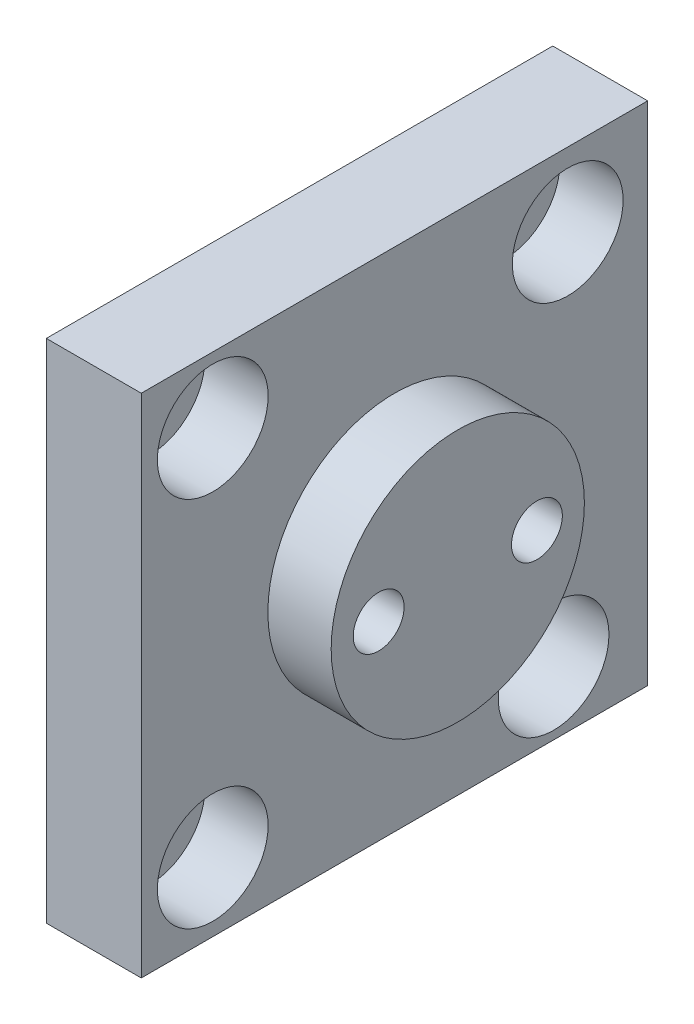
ISO-10303-21;
HEADER;
FILE_DESCRIPTION(('STEP AP214'),'2;1');
FILE_NAME('part.step','',(''),(''),'','','');
FILE_SCHEMA(('AUTOMOTIVE_DESIGN { 1 0 10303 214 1 1 1 1 }'));
ENDSEC;
DATA;
#1=APPLICATION_CONTEXT('core data for automotive mechanical design processes');
#2=APPLICATION_PROTOCOL_DEFINITION('international standard','automotive_design',2000,#1);
#3=PRODUCT_CONTEXT('',#1,'mechanical');
#4=PRODUCT('Part','Part','',(#3));
#5=PRODUCT_RELATED_PRODUCT_CATEGORY('part','',(#4));
#6=PRODUCT_DEFINITION_FORMATION('','',#4);
#7=PRODUCT_DEFINITION_CONTEXT('part definition',#1,'design');
#8=PRODUCT_DEFINITION('design','',#6,#7);
#9=PRODUCT_DEFINITION_SHAPE('','',#8);
#10=(LENGTH_UNIT() NAMED_UNIT(*) SI_UNIT(.MILLI.,.METRE.));
#11=(NAMED_UNIT(*) PLANE_ANGLE_UNIT() SI_UNIT($,.RADIAN.));
#12=(NAMED_UNIT(*) SI_UNIT($,.STERADIAN.) SOLID_ANGLE_UNIT());
#13=UNCERTAINTY_MEASURE_WITH_UNIT(LENGTH_MEASURE(1.E-05),#10,'distance_accuracy_value','');
#14=(GEOMETRIC_REPRESENTATION_CONTEXT(3) GLOBAL_UNCERTAINTY_ASSIGNED_CONTEXT((#13)) GLOBAL_UNIT_ASSIGNED_CONTEXT((#10,
#11,#12)) REPRESENTATION_CONTEXT('',''));
#15=CARTESIAN_POINT('',(0.,0.,0.));
#16=DIRECTION('',(0.,0.,1.));
#17=DIRECTION('',(1.,0.,0.));
#18=AXIS2_PLACEMENT_3D('',#15,#16,#17);
#19=CARTESIAN_POINT('',(9.525,25.4,-25.4));
#20=DIRECTION('',(0.,0.,1.));
#21=DIRECTION('',(0.,-1.,0.));
#22=AXIS2_PLACEMENT_3D('',#19,#20,#21);
#23=PLANE('',#22);
#24=DIRECTION('',(0.,1.,0.));
#25=VECTOR('',#24,1.);
#26=CARTESIAN_POINT('',(0.,25.4,-25.4));
#27=LINE('',#26,#25);
#28=CARTESIAN_POINT('',(0.,-25.4,-25.4));
#29=VERTEX_POINT('',#28);
#30=CARTESIAN_POINT('',(0.,25.4,-25.4));
#31=VERTEX_POINT('',#30);
#32=EDGE_CURVE('E108',#29,#31,#27,.T.);
#33=ORIENTED_EDGE('',*,*,#32,.T.);
#34=DIRECTION('',(-1.,0.,0.));
#35=VECTOR('',#34,1.);
#36=CARTESIAN_POINT('',(9.525,25.4,-25.4));
#37=LINE('',#36,#35);
#38=CARTESIAN_POINT('',(9.525,25.4,-25.4));
#39=VERTEX_POINT('',#38);
#40=EDGE_CURVE('E45',#39,#31,#37,.T.);
#41=ORIENTED_EDGE('',*,*,#40,.F.);
#42=DIRECTION('',(0.,1.,0.));
#43=VECTOR('',#42,1.);
#44=CARTESIAN_POINT('',(9.525,25.4,-25.4));
#45=LINE('',#44,#43);
#46=CARTESIAN_POINT('',(9.525,-25.4,-25.4));
#47=VERTEX_POINT('',#46);
#48=EDGE_CURVE('E95',#47,#39,#45,.T.);
#49=ORIENTED_EDGE('',*,*,#48,.F.);
#50=DIRECTION('',(-1.,0.,0.));
#51=VECTOR('',#50,1.);
#52=CARTESIAN_POINT('',(9.525,-25.4,-25.4));
#53=LINE('',#52,#51);
#54=EDGE_CURVE('E104',#47,#29,#53,.T.);
#55=ORIENTED_EDGE('',*,*,#54,.T.);
#56=EDGE_LOOP('',(#33,#41,#49,#55));
#57=FACE_BOUND('',#56,.T.);
#58=ADVANCED_FACE('F42',(#57),#23,.F.);
#59=CARTESIAN_POINT('',(9.525,25.4,25.4));
#60=DIRECTION('',(0.,-1.,0.));
#61=DIRECTION('',(0.,0.,-1.));
#62=AXIS2_PLACEMENT_3D('',#59,#60,#61);
#63=PLANE('',#62);
#64=DIRECTION('',(0.,0.,1.));
#65=VECTOR('',#64,1.);
#66=CARTESIAN_POINT('',(0.,25.4,25.4));
#67=LINE('',#66,#65);
#68=CARTESIAN_POINT('',(0.,25.4,25.4));
#69=VERTEX_POINT('',#68);
#70=EDGE_CURVE('E100',#31,#69,#67,.T.);
#71=ORIENTED_EDGE('',*,*,#70,.T.);
#72=DIRECTION('',(-1.,0.,0.));
#73=VECTOR('',#72,1.);
#74=CARTESIAN_POINT('',(9.525,25.4,25.4));
#75=LINE('',#74,#73);
#76=CARTESIAN_POINT('',(9.525,25.4,25.4));
#77=VERTEX_POINT('',#76);
#78=EDGE_CURVE('E98',#77,#69,#75,.T.);
#79=ORIENTED_EDGE('',*,*,#78,.F.);
#80=DIRECTION('',(0.,0.,1.));
#81=VECTOR('',#80,1.);
#82=CARTESIAN_POINT('',(9.525,25.4,25.4));
#83=LINE('',#82,#81);
#84=EDGE_CURVE('E90',#39,#77,#83,.T.);
#85=ORIENTED_EDGE('',*,*,#84,.F.);
#86=ORIENTED_EDGE('',*,*,#40,.T.);
#87=EDGE_LOOP('',(#71,#79,#85,#86));
#88=FACE_BOUND('',#87,.T.);
#89=ADVANCED_FACE('F99',(#88),#63,.F.);
#90=CARTESIAN_POINT('',(9.525,25.4,25.4));
#91=DIRECTION('',(0.,0.,-1.));
#92=DIRECTION('',(-1.,0.,0.));
#93=AXIS2_PLACEMENT_3D('',#90,#91,#92);
#94=PLANE('',#93);
#95=DIRECTION('',(0.,-1.,0.));
#96=VECTOR('',#95,1.);
#97=CARTESIAN_POINT('',(0.,25.4,25.4));
#98=LINE('',#97,#96);
#99=CARTESIAN_POINT('',(0.,-25.4,25.4));
#100=VERTEX_POINT('',#99);
#101=EDGE_CURVE('E76',#69,#100,#98,.T.);
#102=ORIENTED_EDGE('',*,*,#101,.T.);
#103=DIRECTION('',(-1.,0.,0.));
#104=VECTOR('',#103,1.);
#105=CARTESIAN_POINT('',(9.525,-25.4,25.4));
#106=LINE('',#105,#104);
#107=CARTESIAN_POINT('',(9.525,-25.4,25.4));
#108=VERTEX_POINT('',#107);
#109=EDGE_CURVE('E101',#108,#100,#106,.T.);
#110=ORIENTED_EDGE('',*,*,#109,.F.);
#111=DIRECTION('',(0.,-1.,0.));
#112=VECTOR('',#111,1.);
#113=CARTESIAN_POINT('',(9.525,25.4,25.4));
#114=LINE('',#113,#112);
#115=EDGE_CURVE('E93',#77,#108,#114,.T.);
#116=ORIENTED_EDGE('',*,*,#115,.F.);
#117=ORIENTED_EDGE('',*,*,#78,.T.);
#118=EDGE_LOOP('',(#102,#110,#116,#117));
#119=FACE_BOUND('',#118,.T.);
#120=ADVANCED_FACE('F102',(#119),#94,.F.);
#121=CARTESIAN_POINT('',(9.525,-25.4,25.4));
#122=DIRECTION('',(0.,1.,0.));
#123=DIRECTION('',(0.,0.,1.));
#124=AXIS2_PLACEMENT_3D('',#121,#122,#123);
#125=PLANE('',#124);
#126=DIRECTION('',(0.,0.,-1.));
#127=VECTOR('',#126,1.);
#128=CARTESIAN_POINT('',(0.,-25.4,25.4));
#129=LINE('',#128,#127);
#130=EDGE_CURVE('E82',#100,#29,#129,.T.);
#131=ORIENTED_EDGE('',*,*,#130,.T.);
#132=ORIENTED_EDGE('',*,*,#54,.F.);
#133=DIRECTION('',(0.,0.,-1.));
#134=VECTOR('',#133,1.);
#135=CARTESIAN_POINT('',(9.525,-25.4,25.4));
#136=LINE('',#135,#134);
#137=EDGE_CURVE('E59',#108,#47,#136,.T.);
#138=ORIENTED_EDGE('',*,*,#137,.F.);
#139=ORIENTED_EDGE('',*,*,#109,.T.);
#140=EDGE_LOOP('',(#131,#132,#138,#139));
#141=FACE_BOUND('',#140,.T.);
#142=ADVANCED_FACE('F116',(#141),#125,.F.);
#143=CARTESIAN_POINT('',(9.525,0.,0.));
#144=DIRECTION('',(1.,0.,0.));
#145=DIRECTION('',(0.,0.,-1.));
#146=AXIS2_PLACEMENT_3D('',#143,#144,#145);
#147=PLANE('',#146);
#148=CARTESIAN_POINT('',(9.525,18.7966388197296,18.2291931195114));
#149=DIRECTION('',(1.,0.,0.));
#150=DIRECTION('',(0.,0.,-1.));
#151=AXIS2_PLACEMENT_3D('',#148,#149,#150);
#152=CIRCLE('',#151,5.55625);
#153=CARTESIAN_POINT('',(9.525,18.7966388197296,12.6729431195114));
#154=VERTEX_POINT('',#153);
#155=EDGE_CURVE('E181',#154,#154,#152,.T.);
#156=ORIENTED_EDGE('',*,*,#155,.F.);
#157=EDGE_LOOP('',(#156));
#158=FACE_BOUND('',#157,.T.);
#159=CARTESIAN_POINT('',(9.525,18.0164009819295,-17.3780245691841));
#160=DIRECTION('',(1.,0.,0.));
#161=DIRECTION('',(0.,0.,-1.));
#162=AXIS2_PLACEMENT_3D('',#159,#160,#161);
#163=CIRCLE('',#162,5.55625);
#164=CARTESIAN_POINT('',(9.525,18.0164009819295,-22.9342745691841));
#165=VERTEX_POINT('',#164);
#166=EDGE_CURVE('E169',#165,#165,#163,.T.);
#167=ORIENTED_EDGE('',*,*,#166,.F.);
#168=EDGE_LOOP('',(#167));
#169=FACE_BOUND('',#168,.T.);
#170=CARTESIAN_POINT('',(9.525,-19.0094309573116,-15.9594103186384));
#171=DIRECTION('',(1.,0.,0.));
#172=DIRECTION('',(0.,0.,-1.));
#173=AXIS2_PLACEMENT_3D('',#170,#171,#172);
#174=CIRCLE('',#173,5.55625);
#175=CARTESIAN_POINT('',(9.525,-19.0094309573116,-21.5156603186384));
#176=VERTEX_POINT('',#175);
#177=EDGE_CURVE('E157',#176,#176,#174,.T.);
#178=ORIENTED_EDGE('',*,*,#177,.F.);
#179=EDGE_LOOP('',(#178));
#180=FACE_BOUND('',#179,.T.);
#181=CARTESIAN_POINT('',(9.525,-18.5129159696206,18.2291931195114));
#182=DIRECTION('',(1.,0.,0.));
#183=DIRECTION('',(0.,0.,-1.));
#184=AXIS2_PLACEMENT_3D('',#181,#182,#183);
#185=CIRCLE('',#184,5.55625);
#186=CARTESIAN_POINT('',(9.525,-18.5129159696206,12.6729431195114));
#187=VERTEX_POINT('',#186);
#188=EDGE_CURVE('E145',#187,#187,#185,.T.);
#189=ORIENTED_EDGE('',*,*,#188,.F.);
#190=EDGE_LOOP('',(#189));
#191=FACE_BOUND('',#190,.T.);
#192=CARTESIAN_POINT('',(9.525,0.,0.));
#193=DIRECTION('',(1.,0.,0.));
#194=DIRECTION('',(0.,0.,-1.));
#195=AXIS2_PLACEMENT_3D('',#192,#193,#194);
#196=CIRCLE('',#195,12.7);
#197=CARTESIAN_POINT('',(9.525,0.,-12.7));
#198=VERTEX_POINT('',#197);
#199=EDGE_CURVE('E11',#198,#198,#196,.T.);
#200=ORIENTED_EDGE('',*,*,#199,.F.);
#201=EDGE_LOOP('',(#200));
#202=FACE_BOUND('',#201,.T.);
#203=ORIENTED_EDGE('',*,*,#48,.T.);
#204=ORIENTED_EDGE('',*,*,#84,.T.);
#205=ORIENTED_EDGE('',*,*,#115,.T.);
#206=ORIENTED_EDGE('',*,*,#137,.T.);
#207=EDGE_LOOP('',(#203,#204,#205,#206));
#208=FACE_BOUND('',#207,.T.);
#209=ADVANCED_FACE('F91',(#158,#169,#180,#191,#202,#208),#147,.T.);
#210=CARTESIAN_POINT('',(0.,0.,0.));
#211=DIRECTION('',(1.,0.,0.));
#212=DIRECTION('',(0.,0.,-1.));
#213=AXIS2_PLACEMENT_3D('',#210,#211,#212);
#214=PLANE('',#213);
#215=CARTESIAN_POINT('',(0.,18.7966388197296,18.2291931195114));
#216=DIRECTION('',(1.,0.,0.));
#217=DIRECTION('',(0.,0.,-1.));
#218=AXIS2_PLACEMENT_3D('',#215,#216,#217);
#219=CIRCLE('',#218,3.3782);
#220=CARTESIAN_POINT('',(0.,18.7966388197296,14.8509931195114));
#221=VERTEX_POINT('',#220);
#222=EDGE_CURVE('E172',#221,#221,#219,.T.);
#223=ORIENTED_EDGE('',*,*,#222,.T.);
#224=EDGE_LOOP('',(#223));
#225=FACE_BOUND('',#224,.T.);
#226=CARTESIAN_POINT('',(0.,18.0164009819295,-17.3780245691841));
#227=DIRECTION('',(1.,0.,0.));
#228=DIRECTION('',(0.,0.,-1.));
#229=AXIS2_PLACEMENT_3D('',#226,#227,#228);
#230=CIRCLE('',#229,3.3782);
#231=CARTESIAN_POINT('',(0.,18.0164009819295,-20.7562245691841));
#232=VERTEX_POINT('',#231);
#233=EDGE_CURVE('E160',#232,#232,#230,.T.);
#234=ORIENTED_EDGE('',*,*,#233,.T.);
#235=EDGE_LOOP('',(#234));
#236=FACE_BOUND('',#235,.T.);
#237=CARTESIAN_POINT('',(0.,-19.0094309573116,-15.9594103186384));
#238=DIRECTION('',(1.,0.,0.));
#239=DIRECTION('',(0.,0.,-1.));
#240=AXIS2_PLACEMENT_3D('',#237,#238,#239);
#241=CIRCLE('',#240,3.3782);
#242=CARTESIAN_POINT('',(0.,-19.0094309573116,-19.3376103186384));
#243=VERTEX_POINT('',#242);
#244=EDGE_CURVE('E148',#243,#243,#241,.T.);
#245=ORIENTED_EDGE('',*,*,#244,.T.);
#246=EDGE_LOOP('',(#245));
#247=FACE_BOUND('',#246,.T.);
#248=CARTESIAN_POINT('',(0.,-18.5129159696206,18.2291931195114));
#249=DIRECTION('',(1.,0.,0.));
#250=DIRECTION('',(0.,0.,-1.));
#251=AXIS2_PLACEMENT_3D('',#248,#249,#250);
#252=CIRCLE('',#251,3.3782);
#253=CARTESIAN_POINT('',(0.,-18.5129159696206,14.8509931195114));
#254=VERTEX_POINT('',#253);
#255=EDGE_CURVE('E136',#254,#254,#252,.T.);
#256=ORIENTED_EDGE('',*,*,#255,.T.);
#257=EDGE_LOOP('',(#256));
#258=FACE_BOUND('',#257,.T.);
#259=CARTESIAN_POINT('',(0.,0.,7.9375));
#260=DIRECTION('',(1.,0.,0.));
#261=DIRECTION('',(0.,0.,-1.));
#262=AXIS2_PLACEMENT_3D('',#259,#260,#261);
#263=CIRCLE('',#262,2.5527);
#264=CARTESIAN_POINT('',(0.,0.,5.3848));
#265=VERTEX_POINT('',#264);
#266=EDGE_CURVE('E130',#265,#265,#263,.T.);
#267=ORIENTED_EDGE('',*,*,#266,.T.);
#268=EDGE_LOOP('',(#267));
#269=FACE_BOUND('',#268,.T.);
#270=CARTESIAN_POINT('',(0.,0.,-7.9375));
#271=DIRECTION('',(1.,0.,0.));
#272=DIRECTION('',(0.,0.,-1.));
#273=AXIS2_PLACEMENT_3D('',#270,#271,#272);
#274=CIRCLE('',#273,2.5527);
#275=CARTESIAN_POINT('',(0.,0.,-10.4902));
#276=VERTEX_POINT('',#275);
#277=EDGE_CURVE('E124',#276,#276,#274,.T.);
#278=ORIENTED_EDGE('',*,*,#277,.T.);
#279=EDGE_LOOP('',(#278));
#280=FACE_BOUND('',#279,.T.);
#281=ORIENTED_EDGE('',*,*,#32,.F.);
#282=ORIENTED_EDGE('',*,*,#130,.F.);
#283=ORIENTED_EDGE('',*,*,#101,.F.);
#284=ORIENTED_EDGE('',*,*,#70,.F.);
#285=EDGE_LOOP('',(#281,#282,#283,#284));
#286=FACE_BOUND('',#285,.T.);
#287=ADVANCED_FACE('F119',(#225,#236,#247,#258,#269,#280,#286),#214,.F.);
#288=CARTESIAN_POINT('',(15.875,0.,0.));
#289=DIRECTION('',(-1.,0.,0.));
#290=DIRECTION('',(0.,0.,1.));
#291=AXIS2_PLACEMENT_3D('',#288,#289,#290);
#292=CYLINDRICAL_SURFACE('',#291,12.7);
#293=CARTESIAN_POINT('',(15.875,0.,0.));
#294=DIRECTION('',(1.,0.,0.));
#295=DIRECTION('',(0.,0.,-1.));
#296=AXIS2_PLACEMENT_3D('',#293,#294,#295);
#297=CIRCLE('',#296,12.7);
#298=CARTESIAN_POINT('',(15.875,0.,-12.7));
#299=VERTEX_POINT('',#298);
#300=EDGE_CURVE('E111',#299,#299,#297,.T.);
#301=ORIENTED_EDGE('',*,*,#300,.F.);
#302=EDGE_LOOP('',(#301));
#303=FACE_BOUND('',#302,.T.);
#304=ORIENTED_EDGE('',*,*,#199,.T.);
#305=EDGE_LOOP('',(#304));
#306=FACE_BOUND('',#305,.T.);
#307=ADVANCED_FACE('F198',(#303,#306),#292,.T.);
#308=CARTESIAN_POINT('',(15.875,0.,0.));
#309=DIRECTION('',(1.,0.,0.));
#310=DIRECTION('',(0.,0.,-1.));
#311=AXIS2_PLACEMENT_3D('',#308,#309,#310);
#312=PLANE('',#311);
#313=CARTESIAN_POINT('',(15.875,0.,7.9375));
#314=DIRECTION('',(1.,0.,0.));
#315=DIRECTION('',(0.,0.,-1.));
#316=AXIS2_PLACEMENT_3D('',#313,#314,#315);
#317=CIRCLE('',#316,2.5527);
#318=CARTESIAN_POINT('',(15.875,0.,5.3848));
#319=VERTEX_POINT('',#318);
#320=EDGE_CURVE('E133',#319,#319,#317,.T.);
#321=ORIENTED_EDGE('',*,*,#320,.F.);
#322=EDGE_LOOP('',(#321));
#323=FACE_BOUND('',#322,.T.);
#324=CARTESIAN_POINT('',(15.875,0.,-7.9375));
#325=DIRECTION('',(1.,0.,0.));
#326=DIRECTION('',(0.,0.,-1.));
#327=AXIS2_PLACEMENT_3D('',#324,#325,#326);
#328=CIRCLE('',#327,2.5527);
#329=CARTESIAN_POINT('',(15.875,0.,-10.4902));
#330=VERTEX_POINT('',#329);
#331=EDGE_CURVE('E127',#330,#330,#328,.T.);
#332=ORIENTED_EDGE('',*,*,#331,.F.);
#333=EDGE_LOOP('',(#332));
#334=FACE_BOUND('',#333,.T.);
#335=ORIENTED_EDGE('',*,*,#300,.T.);
#336=EDGE_LOOP('',(#335));
#337=FACE_BOUND('',#336,.T.);
#338=ADVANCED_FACE('F200',(#323,#334,#337),#312,.T.);
#339=CARTESIAN_POINT('',(15.875,0.,-7.9375));
#340=DIRECTION('',(1.,0.,0.));
#341=DIRECTION('',(0.,0.,-1.));
#342=AXIS2_PLACEMENT_3D('',#339,#340,#341);
#343=CYLINDRICAL_SURFACE('',#342,2.5527);
#344=ORIENTED_EDGE('',*,*,#277,.F.);
#345=EDGE_LOOP('',(#344));
#346=FACE_BOUND('',#345,.T.);
#347=ORIENTED_EDGE('',*,*,#331,.T.);
#348=EDGE_LOOP('',(#347));
#349=FACE_BOUND('',#348,.T.);
#350=ADVANCED_FACE('F207',(#346,#349),#343,.F.);
#351=CARTESIAN_POINT('',(15.875,0.,7.9375));
#352=DIRECTION('',(1.,0.,0.));
#353=DIRECTION('',(0.,0.,-1.));
#354=AXIS2_PLACEMENT_3D('',#351,#352,#353);
#355=CYLINDRICAL_SURFACE('',#354,2.5527);
#356=ORIENTED_EDGE('',*,*,#266,.F.);
#357=EDGE_LOOP('',(#356));
#358=FACE_BOUND('',#357,.T.);
#359=ORIENTED_EDGE('',*,*,#320,.T.);
#360=EDGE_LOOP('',(#359));
#361=FACE_BOUND('',#360,.T.);
#362=ADVANCED_FACE('F249',(#358,#361),#355,.F.);
#363=CARTESIAN_POINT('',(9.525,-18.5129159696206,18.2291931195114));
#364=DIRECTION('',(1.,0.,0.));
#365=DIRECTION('',(0.,0.,-1.));
#366=AXIS2_PLACEMENT_3D('',#363,#364,#365);
#367=CYLINDRICAL_SURFACE('',#366,3.3782);
#368=ORIENTED_EDGE('',*,*,#255,.F.);
#369=EDGE_LOOP('',(#368));
#370=FACE_BOUND('',#369,.T.);
#371=CARTESIAN_POINT('',(3.175,-18.5129159696206,18.2291931195114));
#372=DIRECTION('',(1.,0.,0.));
#373=DIRECTION('',(0.,0.,-1.));
#374=AXIS2_PLACEMENT_3D('',#371,#372,#373);
#375=CIRCLE('',#374,3.3782);
#376=CARTESIAN_POINT('',(3.175,-18.5129159696206,14.8509931195114));
#377=VERTEX_POINT('',#376);
#378=EDGE_CURVE('E139',#377,#377,#375,.T.);
#379=ORIENTED_EDGE('',*,*,#378,.T.);
#380=EDGE_LOOP('',(#379));
#381=FACE_BOUND('',#380,.T.);
#382=ADVANCED_FACE('F243',(#370,#381),#367,.F.);
#383=CARTESIAN_POINT('',(3.175,-15.1347159696206,18.2291931195114));
#384=DIRECTION('',(-1.,0.,0.));
#385=DIRECTION('',(0.,0.,1.));
#386=AXIS2_PLACEMENT_3D('',#383,#384,#385);
#387=PLANE('',#386);
#388=ORIENTED_EDGE('',*,*,#378,.F.);
#389=EDGE_LOOP('',(#388));
#390=FACE_BOUND('',#389,.T.);
#391=CARTESIAN_POINT('',(3.175,-18.5129159696206,18.2291931195114));
#392=DIRECTION('',(1.,0.,0.));
#393=DIRECTION('',(0.,0.,-1.));
#394=AXIS2_PLACEMENT_3D('',#391,#392,#393);
#395=CIRCLE('',#394,5.55625);
#396=CARTESIAN_POINT('',(3.175,-18.5129159696206,12.6729431195114));
#397=VERTEX_POINT('',#396);
#398=EDGE_CURVE('E142',#397,#397,#395,.T.);
#399=ORIENTED_EDGE('',*,*,#398,.T.);
#400=EDGE_LOOP('',(#399));
#401=FACE_BOUND('',#400,.T.);
#402=ADVANCED_FACE('F248',(#390,#401),#387,.F.);
#403=CARTESIAN_POINT('',(9.525,-18.5129159696206,18.2291931195114));
#404=DIRECTION('',(1.,0.,0.));
#405=DIRECTION('',(0.,0.,-1.));
#406=AXIS2_PLACEMENT_3D('',#403,#404,#405);
#407=CYLINDRICAL_SURFACE('',#406,5.55625);
#408=ORIENTED_EDGE('',*,*,#398,.F.);
#409=EDGE_LOOP('',(#408));
#410=FACE_BOUND('',#409,.T.);
#411=ORIENTED_EDGE('',*,*,#188,.T.);
#412=EDGE_LOOP('',(#411));
#413=FACE_BOUND('',#412,.T.);
#414=ADVANCED_FACE('F262',(#410,#413),#407,.F.);
#415=CARTESIAN_POINT('',(9.525,-19.0094309573116,-15.9594103186384));
#416=DIRECTION('',(1.,0.,0.));
#417=DIRECTION('',(0.,0.,-1.));
#418=AXIS2_PLACEMENT_3D('',#415,#416,#417);
#419=CYLINDRICAL_SURFACE('',#418,3.3782);
#420=ORIENTED_EDGE('',*,*,#244,.F.);
#421=EDGE_LOOP('',(#420));
#422=FACE_BOUND('',#421,.T.);
#423=CARTESIAN_POINT('',(3.175,-19.0094309573116,-15.9594103186384));
#424=DIRECTION('',(1.,0.,0.));
#425=DIRECTION('',(0.,0.,-1.));
#426=AXIS2_PLACEMENT_3D('',#423,#424,#425);
#427=CIRCLE('',#426,3.3782);
#428=CARTESIAN_POINT('',(3.175,-19.0094309573116,-19.3376103186384));
#429=VERTEX_POINT('',#428);
#430=EDGE_CURVE('E151',#429,#429,#427,.T.);
#431=ORIENTED_EDGE('',*,*,#430,.T.);
#432=EDGE_LOOP('',(#431));
#433=FACE_BOUND('',#432,.T.);
#434=ADVANCED_FACE('F273',(#422,#433),#419,.F.);
#435=CARTESIAN_POINT('',(3.175,-15.6312309573116,-15.9594103186384));
#436=DIRECTION('',(-1.,0.,0.));
#437=DIRECTION('',(0.,0.,1.));
#438=AXIS2_PLACEMENT_3D('',#435,#436,#437);
#439=PLANE('',#438);
#440=ORIENTED_EDGE('',*,*,#430,.F.);
#441=EDGE_LOOP('',(#440));
#442=FACE_BOUND('',#441,.T.);
#443=CARTESIAN_POINT('',(3.175,-19.0094309573116,-15.9594103186384));
#444=DIRECTION('',(1.,0.,0.));
#445=DIRECTION('',(0.,0.,-1.));
#446=AXIS2_PLACEMENT_3D('',#443,#444,#445);
#447=CIRCLE('',#446,5.55625);
#448=CARTESIAN_POINT('',(3.175,-19.0094309573116,-21.5156603186384));
#449=VERTEX_POINT('',#448);
#450=EDGE_CURVE('E154',#449,#449,#447,.T.);
#451=ORIENTED_EDGE('',*,*,#450,.T.);
#452=EDGE_LOOP('',(#451));
#453=FACE_BOUND('',#452,.T.);
#454=ADVANCED_FACE('F284',(#442,#453),#439,.F.);
#455=CARTESIAN_POINT('',(9.525,-19.0094309573116,-15.9594103186384));
#456=DIRECTION('',(1.,0.,0.));
#457=DIRECTION('',(0.,0.,-1.));
#458=AXIS2_PLACEMENT_3D('',#455,#456,#457);
#459=CYLINDRICAL_SURFACE('',#458,5.55625);
#460=ORIENTED_EDGE('',*,*,#450,.F.);
#461=EDGE_LOOP('',(#460));
#462=FACE_BOUND('',#461,.T.);
#463=ORIENTED_EDGE('',*,*,#177,.T.);
#464=EDGE_LOOP('',(#463));
#465=FACE_BOUND('',#464,.T.);
#466=ADVANCED_FACE('F295',(#462,#465),#459,.F.);
#467=CARTESIAN_POINT('',(9.525,18.0164009819295,-17.3780245691841));
#468=DIRECTION('',(1.,0.,0.));
#469=DIRECTION('',(0.,0.,-1.));
#470=AXIS2_PLACEMENT_3D('',#467,#468,#469);
#471=CYLINDRICAL_SURFACE('',#470,3.3782);
#472=ORIENTED_EDGE('',*,*,#233,.F.);
#473=EDGE_LOOP('',(#472));
#474=FACE_BOUND('',#473,.T.);
#475=CARTESIAN_POINT('',(3.175,18.0164009819295,-17.3780245691841));
#476=DIRECTION('',(1.,0.,0.));
#477=DIRECTION('',(0.,0.,-1.));
#478=AXIS2_PLACEMENT_3D('',#475,#476,#477);
#479=CIRCLE('',#478,3.3782);
#480=CARTESIAN_POINT('',(3.175,18.0164009819295,-20.7562245691841));
#481=VERTEX_POINT('',#480);
#482=EDGE_CURVE('E163',#481,#481,#479,.T.);
#483=ORIENTED_EDGE('',*,*,#482,.T.);
#484=EDGE_LOOP('',(#483));
#485=FACE_BOUND('',#484,.T.);
#486=ADVANCED_FACE('F306',(#474,#485),#471,.F.);
#487=CARTESIAN_POINT('',(3.175,21.3946009819295,-17.3780245691841));
#488=DIRECTION('',(-1.,0.,0.));
#489=DIRECTION('',(0.,0.,1.));
#490=AXIS2_PLACEMENT_3D('',#487,#488,#489);
#491=PLANE('',#490);
#492=ORIENTED_EDGE('',*,*,#482,.F.);
#493=EDGE_LOOP('',(#492));
#494=FACE_BOUND('',#493,.T.);
#495=CARTESIAN_POINT('',(3.175,18.0164009819295,-17.3780245691841));
#496=DIRECTION('',(1.,0.,0.));
#497=DIRECTION('',(0.,0.,-1.));
#498=AXIS2_PLACEMENT_3D('',#495,#496,#497);
#499=CIRCLE('',#498,5.55625);
#500=CARTESIAN_POINT('',(3.175,18.0164009819295,-22.9342745691841));
#501=VERTEX_POINT('',#500);
#502=EDGE_CURVE('E166',#501,#501,#499,.T.);
#503=ORIENTED_EDGE('',*,*,#502,.T.);
#504=EDGE_LOOP('',(#503));
#505=FACE_BOUND('',#504,.T.);
#506=ADVANCED_FACE('F317',(#494,#505),#491,.F.);
#507=CARTESIAN_POINT('',(9.525,18.0164009819295,-17.3780245691841));
#508=DIRECTION('',(1.,0.,0.));
#509=DIRECTION('',(0.,0.,-1.));
#510=AXIS2_PLACEMENT_3D('',#507,#508,#509);
#511=CYLINDRICAL_SURFACE('',#510,5.55625);
#512=ORIENTED_EDGE('',*,*,#502,.F.);
#513=EDGE_LOOP('',(#512));
#514=FACE_BOUND('',#513,.T.);
#515=ORIENTED_EDGE('',*,*,#166,.T.);
#516=EDGE_LOOP('',(#515));
#517=FACE_BOUND('',#516,.T.);
#518=ADVANCED_FACE('F328',(#514,#517),#511,.F.);
#519=CARTESIAN_POINT('',(9.525,18.7966388197296,18.2291931195114));
#520=DIRECTION('',(1.,0.,0.));
#521=DIRECTION('',(0.,0.,-1.));
#522=AXIS2_PLACEMENT_3D('',#519,#520,#521);
#523=CYLINDRICAL_SURFACE('',#522,3.3782);
#524=ORIENTED_EDGE('',*,*,#222,.F.);
#525=EDGE_LOOP('',(#524));
#526=FACE_BOUND('',#525,.T.);
#527=CARTESIAN_POINT('',(3.175,18.7966388197296,18.2291931195114));
#528=DIRECTION('',(1.,0.,0.));
#529=DIRECTION('',(0.,0.,-1.));
#530=AXIS2_PLACEMENT_3D('',#527,#528,#529);
#531=CIRCLE('',#530,3.3782);
#532=CARTESIAN_POINT('',(3.175,18.7966388197296,14.8509931195114));
#533=VERTEX_POINT('',#532);
#534=EDGE_CURVE('E175',#533,#533,#531,.T.);
#535=ORIENTED_EDGE('',*,*,#534,.T.);
#536=EDGE_LOOP('',(#535));
#537=FACE_BOUND('',#536,.T.);
#538=ADVANCED_FACE('F339',(#526,#537),#523,.F.);
#539=CARTESIAN_POINT('',(3.175,22.1748388197296,18.2291931195114));
#540=DIRECTION('',(-1.,0.,0.));
#541=DIRECTION('',(0.,0.,1.));
#542=AXIS2_PLACEMENT_3D('',#539,#540,#541);
#543=PLANE('',#542);
#544=ORIENTED_EDGE('',*,*,#534,.F.);
#545=EDGE_LOOP('',(#544));
#546=FACE_BOUND('',#545,.T.);
#547=CARTESIAN_POINT('',(3.175,18.7966388197296,18.2291931195114));
#548=DIRECTION('',(1.,0.,0.));
#549=DIRECTION('',(0.,0.,-1.));
#550=AXIS2_PLACEMENT_3D('',#547,#548,#549);
#551=CIRCLE('',#550,5.55625);
#552=CARTESIAN_POINT('',(3.175,18.7966388197296,12.6729431195114));
#553=VERTEX_POINT('',#552);
#554=EDGE_CURVE('E178',#553,#553,#551,.T.);
#555=ORIENTED_EDGE('',*,*,#554,.T.);
#556=EDGE_LOOP('',(#555));
#557=FACE_BOUND('',#556,.T.);
#558=ADVANCED_FACE('F350',(#546,#557),#543,.F.);
#559=CARTESIAN_POINT('',(9.525,18.7966388197296,18.2291931195114));
#560=DIRECTION('',(1.,0.,0.));
#561=DIRECTION('',(0.,0.,-1.));
#562=AXIS2_PLACEMENT_3D('',#559,#560,#561);
#563=CYLINDRICAL_SURFACE('',#562,5.55625);
#564=ORIENTED_EDGE('',*,*,#554,.F.);
#565=EDGE_LOOP('',(#564));
#566=FACE_BOUND('',#565,.T.);
#567=ORIENTED_EDGE('',*,*,#155,.T.);
#568=EDGE_LOOP('',(#567));
#569=FACE_BOUND('',#568,.T.);
#570=ADVANCED_FACE('F185',(#566,#569),#563,.F.);
#571=CLOSED_SHELL('',(#58,#89,#120,#142,#209,#287,#307,#338,#350,#362,#382,#402,#414,#434,#454,
#466,#486,#506,#518,#538,#558,#570));
#572=MANIFOLD_SOLID_BREP('B2',#571);
#573=ADVANCED_BREP_SHAPE_REPRESENTATION('',(#18,#572),#14);
#574=SHAPE_DEFINITION_REPRESENTATION(#9,#573);
ENDSEC;
END-ISO-10303-21;
